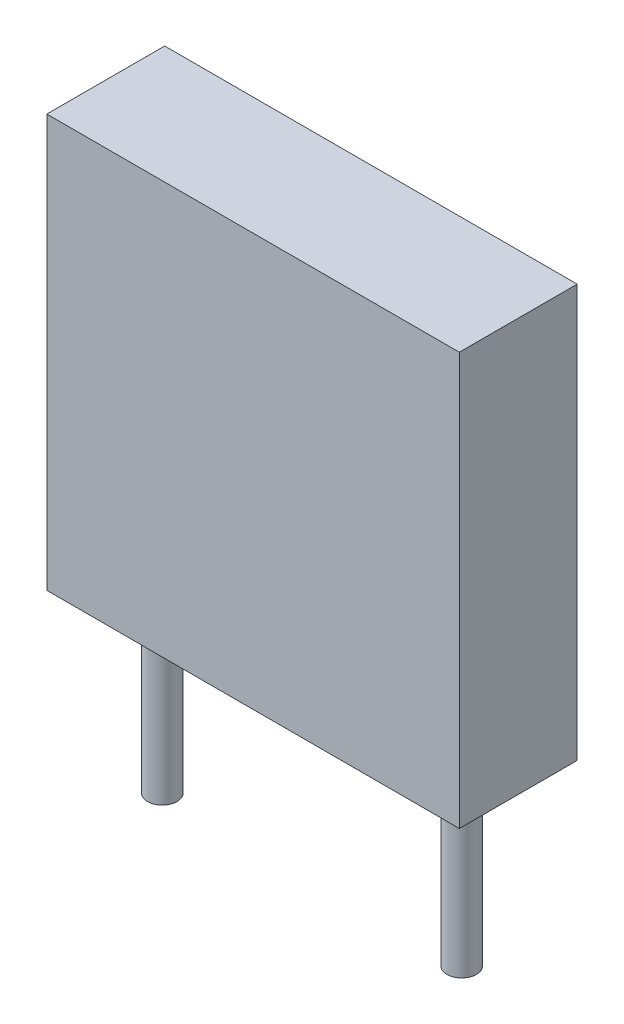
ISO-10303-21;
HEADER;
FILE_DESCRIPTION(('STEP AP214'),'2;1');
FILE_NAME('part.step','',(''),(''),'','','');
FILE_SCHEMA(('AUTOMOTIVE_DESIGN { 1 0 10303 214 1 1 1 1 }'));
ENDSEC;
DATA;
#1=APPLICATION_CONTEXT('core data for automotive mechanical design processes');
#2=APPLICATION_PROTOCOL_DEFINITION('international standard','automotive_design',2000,#1);
#3=PRODUCT_CONTEXT('',#1,'mechanical');
#4=PRODUCT('Part','Part','',(#3));
#5=PRODUCT_RELATED_PRODUCT_CATEGORY('part','',(#4));
#6=PRODUCT_DEFINITION_FORMATION('','',#4);
#7=PRODUCT_DEFINITION_CONTEXT('part definition',#1,'design');
#8=PRODUCT_DEFINITION('design','',#6,#7);
#9=PRODUCT_DEFINITION_SHAPE('','',#8);
#10=(LENGTH_UNIT() NAMED_UNIT(*) SI_UNIT(.MILLI.,.METRE.));
#11=(NAMED_UNIT(*) PLANE_ANGLE_UNIT() SI_UNIT($,.RADIAN.));
#12=(NAMED_UNIT(*) SI_UNIT($,.STERADIAN.) SOLID_ANGLE_UNIT());
#13=UNCERTAINTY_MEASURE_WITH_UNIT(LENGTH_MEASURE(1.E-05),#10,'distance_accuracy_value','');
#14=(GEOMETRIC_REPRESENTATION_CONTEXT(3) GLOBAL_UNCERTAINTY_ASSIGNED_CONTEXT((#13)) GLOBAL_UNIT_ASSIGNED_CONTEXT((#10,
#11,#12)) REPRESENTATION_CONTEXT('',''));
#15=CARTESIAN_POINT('',(0.,0.,0.));
#16=DIRECTION('',(0.,0.,1.));
#17=DIRECTION('',(1.,0.,0.));
#18=AXIS2_PLACEMENT_3D('',#15,#16,#17);
#19=CARTESIAN_POINT('',(0.,0.,-2.));
#20=DIRECTION('',(0.,-1.,0.));
#21=DIRECTION('',(0.,0.,-1.));
#22=AXIS2_PLACEMENT_3D('',#19,#20,#21);
#23=PLANE('',#22);
#24=CARTESIAN_POINT('',(0.96,0.,-1.));
#25=DIRECTION('',(0.,-1.,0.));
#26=DIRECTION('',(0.,0.,1.));
#27=AXIS2_PLACEMENT_3D('',#24,#25,#26);
#28=CIRCLE('',#27,0.25);
#29=CARTESIAN_POINT('',(0.96,0.,-0.75));
#30=VERTEX_POINT('',#29);
#31=EDGE_CURVE('E92',#30,#30,#28,.T.);
#32=ORIENTED_EDGE('',*,*,#31,.F.);
#33=EDGE_LOOP('',(#32));
#34=FACE_BOUND('',#33,.T.);
#35=DIRECTION('',(0.,0.,1.));
#36=VECTOR('',#35,1.);
#37=CARTESIAN_POINT('',(0.,0.,0.));
#38=LINE('',#37,#36);
#39=CARTESIAN_POINT('',(0.,0.,-2.));
#40=VERTEX_POINT('',#39);
#41=CARTESIAN_POINT('',(0.,0.,0.));
#42=VERTEX_POINT('',#41);
#43=EDGE_CURVE('E76',#40,#42,#38,.T.);
#44=ORIENTED_EDGE('',*,*,#43,.F.);
#45=DIRECTION('',(-1.,0.,0.));
#46=VECTOR('',#45,1.);
#47=CARTESIAN_POINT('',(0.,0.,-2.));
#48=LINE('',#47,#46);
#49=CARTESIAN_POINT('',(7.,0.,-2.));
#50=VERTEX_POINT('',#49);
#51=EDGE_CURVE('E97',#50,#40,#48,.T.);
#52=ORIENTED_EDGE('',*,*,#51,.F.);
#53=DIRECTION('',(0.,0.,-1.));
#54=VECTOR('',#53,1.);
#55=CARTESIAN_POINT('',(7.,0.,0.));
#56=LINE('',#55,#54);
#57=CARTESIAN_POINT('',(7.,0.,0.));
#58=VERTEX_POINT('',#57);
#59=EDGE_CURVE('E77',#58,#50,#56,.T.);
#60=ORIENTED_EDGE('',*,*,#59,.F.);
#61=DIRECTION('',(1.,0.,0.));
#62=VECTOR('',#61,1.);
#63=CARTESIAN_POINT('',(0.,0.,0.));
#64=LINE('',#63,#62);
#65=EDGE_CURVE('E72',#42,#58,#64,.T.);
#66=ORIENTED_EDGE('',*,*,#65,.F.);
#67=EDGE_LOOP('',(#44,#52,#60,#66));
#68=FACE_BOUND('',#67,.T.);
#69=CARTESIAN_POINT('',(6.04,0.,-1.));
#70=DIRECTION('',(0.,-1.,0.));
#71=DIRECTION('',(0.,0.,-1.));
#72=AXIS2_PLACEMENT_3D('',#69,#70,#71);
#73=CIRCLE('',#72,0.25);
#74=CARTESIAN_POINT('',(6.04,0.,-1.25));
#75=VERTEX_POINT('',#74);
#76=EDGE_CURVE('E146',#75,#75,#73,.T.);
#77=ORIENTED_EDGE('',*,*,#76,.F.);
#78=EDGE_LOOP('',(#77));
#79=FACE_BOUND('',#78,.T.);
#80=ADVANCED_FACE('F31',(#34,#68,#79),#23,.T.);
#81=CARTESIAN_POINT('',(0.,7.,0.));
#82=DIRECTION('',(1.,0.,0.));
#83=DIRECTION('',(0.,0.,-1.));
#84=AXIS2_PLACEMENT_3D('',#81,#82,#83);
#85=PLANE('',#84);
#86=ORIENTED_EDGE('',*,*,#43,.T.);
#87=DIRECTION('',(0.,-1.,0.));
#88=VECTOR('',#87,1.);
#89=CARTESIAN_POINT('',(0.,7.,0.));
#90=LINE('',#89,#88);
#91=CARTESIAN_POINT('',(0.,7.,0.));
#92=VERTEX_POINT('',#91);
#93=EDGE_CURVE('E11',#92,#42,#90,.T.);
#94=ORIENTED_EDGE('',*,*,#93,.F.);
#95=DIRECTION('',(0.,0.,1.));
#96=VECTOR('',#95,1.);
#97=CARTESIAN_POINT('',(0.,7.,0.));
#98=LINE('',#97,#96);
#99=CARTESIAN_POINT('',(0.,7.,-2.));
#100=VERTEX_POINT('',#99);
#101=EDGE_CURVE('E99',#100,#92,#98,.T.);
#102=ORIENTED_EDGE('',*,*,#101,.F.);
#103=DIRECTION('',(0.,-1.,0.));
#104=VECTOR('',#103,1.);
#105=CARTESIAN_POINT('',(0.,7.,-2.));
#106=LINE('',#105,#104);
#107=EDGE_CURVE('E88',#100,#40,#106,.T.);
#108=ORIENTED_EDGE('',*,*,#107,.T.);
#109=EDGE_LOOP('',(#86,#94,#102,#108));
#110=FACE_BOUND('',#109,.T.);
#111=ADVANCED_FACE('F33',(#110),#85,.F.);
#112=CARTESIAN_POINT('',(0.,7.,0.));
#113=DIRECTION('',(0.,0.,-1.));
#114=DIRECTION('',(-1.,0.,0.));
#115=AXIS2_PLACEMENT_3D('',#112,#113,#114);
#116=PLANE('',#115);
#117=ORIENTED_EDGE('',*,*,#65,.T.);
#118=DIRECTION('',(0.,-1.,0.));
#119=VECTOR('',#118,1.);
#120=CARTESIAN_POINT('',(7.,7.,0.));
#121=LINE('',#120,#119);
#122=CARTESIAN_POINT('',(7.,7.,0.));
#123=VERTEX_POINT('',#122);
#124=EDGE_CURVE('E39',#123,#58,#121,.T.);
#125=ORIENTED_EDGE('',*,*,#124,.F.);
#126=DIRECTION('',(1.,0.,0.));
#127=VECTOR('',#126,1.);
#128=CARTESIAN_POINT('',(0.,7.,0.));
#129=LINE('',#128,#127);
#130=EDGE_CURVE('E84',#92,#123,#129,.T.);
#131=ORIENTED_EDGE('',*,*,#130,.F.);
#132=ORIENTED_EDGE('',*,*,#93,.T.);
#133=EDGE_LOOP('',(#117,#125,#131,#132));
#134=FACE_BOUND('',#133,.T.);
#135=ADVANCED_FACE('F83',(#134),#116,.F.);
#136=CARTESIAN_POINT('',(7.,7.,0.));
#137=DIRECTION('',(-1.,0.,0.));
#138=DIRECTION('',(0.,0.,1.));
#139=AXIS2_PLACEMENT_3D('',#136,#137,#138);
#140=PLANE('',#139);
#141=ORIENTED_EDGE('',*,*,#59,.T.);
#142=DIRECTION('',(0.,-1.,0.));
#143=VECTOR('',#142,1.);
#144=CARTESIAN_POINT('',(7.,7.,-2.));
#145=LINE('',#144,#143);
#146=CARTESIAN_POINT('',(7.,7.,-2.));
#147=VERTEX_POINT('',#146);
#148=EDGE_CURVE('E105',#147,#50,#145,.T.);
#149=ORIENTED_EDGE('',*,*,#148,.F.);
#150=DIRECTION('',(0.,0.,-1.));
#151=VECTOR('',#150,1.);
#152=CARTESIAN_POINT('',(7.,7.,0.));
#153=LINE('',#152,#151);
#154=EDGE_CURVE('E51',#123,#147,#153,.T.);
#155=ORIENTED_EDGE('',*,*,#154,.F.);
#156=ORIENTED_EDGE('',*,*,#124,.T.);
#157=EDGE_LOOP('',(#141,#149,#155,#156));
#158=FACE_BOUND('',#157,.T.);
#159=ADVANCED_FACE('F108',(#158),#140,.F.);
#160=CARTESIAN_POINT('',(0.,7.,-2.));
#161=DIRECTION('',(0.,0.,1.));
#162=DIRECTION('',(1.,0.,0.));
#163=AXIS2_PLACEMENT_3D('',#160,#161,#162);
#164=PLANE('',#163);
#165=ORIENTED_EDGE('',*,*,#51,.T.);
#166=ORIENTED_EDGE('',*,*,#107,.F.);
#167=DIRECTION('',(-1.,0.,0.));
#168=VECTOR('',#167,1.);
#169=CARTESIAN_POINT('',(0.,7.,-2.));
#170=LINE('',#169,#168);
#171=EDGE_CURVE('E46',#147,#100,#170,.T.);
#172=ORIENTED_EDGE('',*,*,#171,.F.);
#173=ORIENTED_EDGE('',*,*,#148,.T.);
#174=EDGE_LOOP('',(#165,#166,#172,#173));
#175=FACE_BOUND('',#174,.T.);
#176=ADVANCED_FACE('F110',(#175),#164,.F.);
#177=CARTESIAN_POINT('',(0.,7.,-2.));
#178=DIRECTION('',(0.,-1.,0.));
#179=DIRECTION('',(0.,0.,-1.));
#180=AXIS2_PLACEMENT_3D('',#177,#178,#179);
#181=PLANE('',#180);
#182=ORIENTED_EDGE('',*,*,#101,.T.);
#183=ORIENTED_EDGE('',*,*,#130,.T.);
#184=ORIENTED_EDGE('',*,*,#154,.T.);
#185=ORIENTED_EDGE('',*,*,#171,.T.);
#186=EDGE_LOOP('',(#182,#183,#184,#185));
#187=FACE_BOUND('',#186,.T.);
#188=ADVANCED_FACE('F111',(#187),#181,.F.);
#189=CARTESIAN_POINT('',(0.96,-3.,-1.));
#190=DIRECTION('',(0.,1.,0.));
#191=DIRECTION('',(0.,0.,1.));
#192=AXIS2_PLACEMENT_3D('',#189,#190,#191);
#193=CYLINDRICAL_SURFACE('',#192,0.25);
#194=CARTESIAN_POINT('',(0.96,-3.,-1.));
#195=DIRECTION('',(0.,-1.,0.));
#196=DIRECTION('',(0.,0.,1.));
#197=AXIS2_PLACEMENT_3D('',#194,#195,#196);
#198=CIRCLE('',#197,0.25);
#199=CARTESIAN_POINT('',(0.96,-3.,-0.75));
#200=VERTEX_POINT('',#199);
#201=EDGE_CURVE('E89',#200,#200,#198,.T.);
#202=ORIENTED_EDGE('',*,*,#201,.F.);
#203=EDGE_LOOP('',(#202));
#204=FACE_BOUND('',#203,.T.);
#205=ORIENTED_EDGE('',*,*,#31,.T.);
#206=EDGE_LOOP('',(#205));
#207=FACE_BOUND('',#206,.T.);
#208=ADVANCED_FACE('F113',(#204,#207),#193,.T.);
#209=CARTESIAN_POINT('',(0.96,-3.,-1.));
#210=DIRECTION('',(0.,1.,0.));
#211=DIRECTION('',(0.,0.,1.));
#212=AXIS2_PLACEMENT_3D('',#209,#210,#211);
#213=PLANE('',#212);
#214=ORIENTED_EDGE('',*,*,#201,.T.);
#215=EDGE_LOOP('',(#214));
#216=FACE_BOUND('',#215,.T.);
#217=ADVANCED_FACE('F120',(#216),#213,.F.);
#218=CARTESIAN_POINT('',(6.04,-3.,-1.));
#219=DIRECTION('',(0.,1.,0.));
#220=DIRECTION('',(0.,0.,1.));
#221=AXIS2_PLACEMENT_3D('',#218,#219,#220);
#222=CYLINDRICAL_SURFACE('',#221,0.25);
#223=CARTESIAN_POINT('',(6.04,-3.,-1.));
#224=DIRECTION('',(0.,-1.,0.));
#225=DIRECTION('',(0.,0.,-1.));
#226=AXIS2_PLACEMENT_3D('',#223,#224,#225);
#227=CIRCLE('',#226,0.25);
#228=CARTESIAN_POINT('',(6.04,-3.,-1.25));
#229=VERTEX_POINT('',#228);
#230=EDGE_CURVE('E145',#229,#229,#227,.T.);
#231=ORIENTED_EDGE('',*,*,#230,.F.);
#232=EDGE_LOOP('',(#231));
#233=FACE_BOUND('',#232,.T.);
#234=ORIENTED_EDGE('',*,*,#76,.T.);
#235=EDGE_LOOP('',(#234));
#236=FACE_BOUND('',#235,.T.);
#237=ADVANCED_FACE('F133',(#233,#236),#222,.T.);
#238=CARTESIAN_POINT('',(6.04,-3.,-1.));
#239=DIRECTION('',(0.,-1.,0.));
#240=DIRECTION('',(0.,0.,-1.));
#241=AXIS2_PLACEMENT_3D('',#238,#239,#240);
#242=PLANE('',#241);
#243=ORIENTED_EDGE('',*,*,#230,.T.);
#244=EDGE_LOOP('',(#243));
#245=FACE_BOUND('',#244,.T.);
#246=ADVANCED_FACE('F137',(#245),#242,.T.);
#247=CLOSED_SHELL('',(#80,#111,#135,#159,#176,#188,#208,#217,#237,#246));
#248=MANIFOLD_SOLID_BREP('B2',#247);
#249=ADVANCED_BREP_SHAPE_REPRESENTATION('',(#18,#248),#14);
#250=SHAPE_DEFINITION_REPRESENTATION(#9,#249);
ENDSEC;
END-ISO-10303-21;
